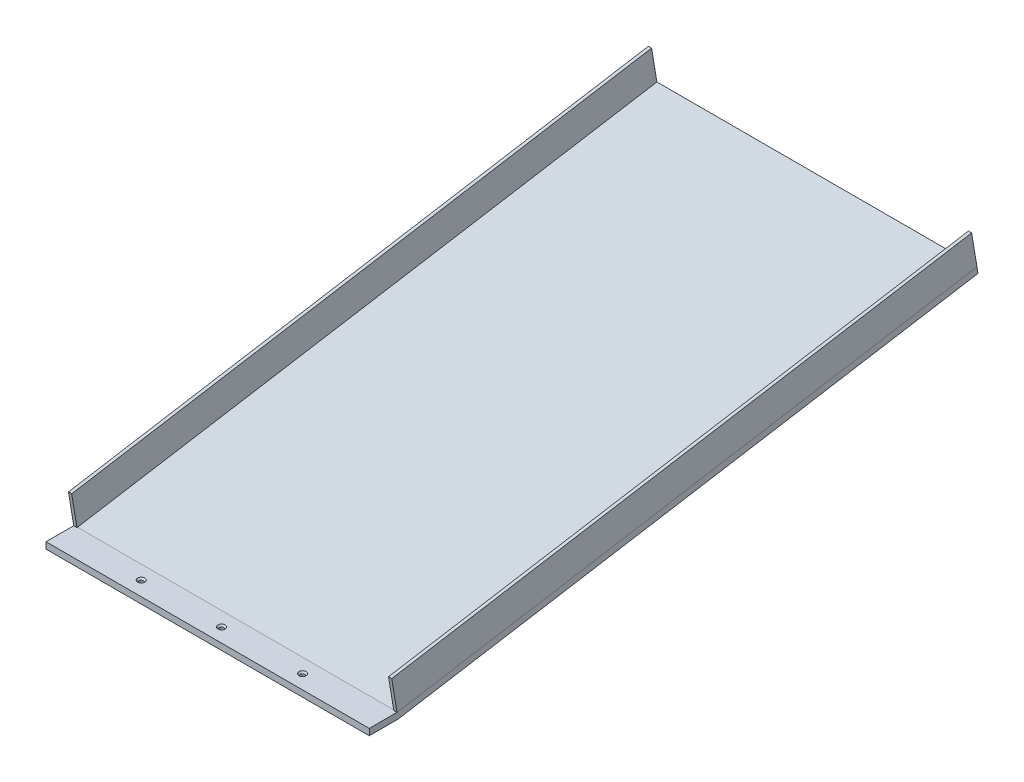
ISO-10303-21;
HEADER;
FILE_DESCRIPTION(('STEP AP214'),'2;1');
FILE_NAME('part.step','',(''),(''),'','','');
FILE_SCHEMA(('AUTOMOTIVE_DESIGN { 1 0 10303 214 1 1 1 1 }'));
ENDSEC;
DATA;
#1=APPLICATION_CONTEXT('core data for automotive mechanical design processes');
#2=APPLICATION_PROTOCOL_DEFINITION('international standard','automotive_design',2000,#1);
#3=PRODUCT_CONTEXT('',#1,'mechanical');
#4=PRODUCT('Part','Part','',(#3));
#5=PRODUCT_RELATED_PRODUCT_CATEGORY('part','',(#4));
#6=PRODUCT_DEFINITION_FORMATION('','',#4);
#7=PRODUCT_DEFINITION_CONTEXT('part definition',#1,'design');
#8=PRODUCT_DEFINITION('design','',#6,#7);
#9=PRODUCT_DEFINITION_SHAPE('','',#8);
#10=(LENGTH_UNIT() NAMED_UNIT(*) SI_UNIT(.MILLI.,.METRE.));
#11=(NAMED_UNIT(*) PLANE_ANGLE_UNIT() SI_UNIT($,.RADIAN.));
#12=(NAMED_UNIT(*) SI_UNIT($,.STERADIAN.) SOLID_ANGLE_UNIT());
#13=UNCERTAINTY_MEASURE_WITH_UNIT(LENGTH_MEASURE(1.E-05),#10,'distance_accuracy_value','');
#14=(GEOMETRIC_REPRESENTATION_CONTEXT(3) GLOBAL_UNCERTAINTY_ASSIGNED_CONTEXT((#13)) GLOBAL_UNIT_ASSIGNED_CONTEXT((#10,
#11,#12)) REPRESENTATION_CONTEXT('',''));
#15=CARTESIAN_POINT('',(0.,0.,0.));
#16=DIRECTION('',(0.,0.,1.));
#17=DIRECTION('',(1.,0.,0.));
#18=AXIS2_PLACEMENT_3D('',#15,#16,#17);
#19=CARTESIAN_POINT('',(125.73,30.4117752847834,5.03506213324225));
#20=DIRECTION('',(0.,-0.163339393700245,0.986569937949478));
#21=DIRECTION('',(0.,-0.986569937949478,-0.163339393700245));
#22=AXIS2_PLACEMENT_3D('',#19,#20,#21);
#23=PLANE('',#22);
#24=DIRECTION('',(0.,-0.986569937949478,-0.163339393700245));
#25=VECTOR('',#24,1.);
#26=CARTESIAN_POINT('',(128.27,30.4117752847834,5.03506213324225));
#27=LINE('',#26,#25);
#28=CARTESIAN_POINT('',(128.27,30.4117752847834,5.03506213324225));
#29=VERTEX_POINT('',#28);
#30=CARTESIAN_POINT('',(128.27,5.01177528478336,0.829764119997197));
#31=VERTEX_POINT('',#30);
#32=EDGE_CURVE('E112',#29,#31,#27,.T.);
#33=ORIENTED_EDGE('',*,*,#32,.F.);
#34=DIRECTION('',(1.,0.,0.));
#35=VECTOR('',#34,1.);
#36=CARTESIAN_POINT('',(125.73,30.4117752847834,5.03506213324225));
#37=LINE('',#36,#35);
#38=CARTESIAN_POINT('',(125.73,30.4117752847834,5.03506213324225));
#39=VERTEX_POINT('',#38);
#40=EDGE_CURVE('E12',#39,#29,#37,.T.);
#41=ORIENTED_EDGE('',*,*,#40,.F.);
#42=DIRECTION('',(0.,-0.986569937949478,-0.163339393700245));
#43=VECTOR('',#42,1.);
#44=CARTESIAN_POINT('',(125.73,30.4117752847834,5.03506213324225));
#45=LINE('',#44,#43);
#46=CARTESIAN_POINT('',(125.73,5.01177528478336,0.829764119997197));
#47=VERTEX_POINT('',#46);
#48=EDGE_CURVE('E106',#39,#47,#45,.T.);
#49=ORIENTED_EDGE('',*,*,#48,.T.);
#50=DIRECTION('',(1.,0.,0.));
#51=VECTOR('',#50,1.);
#52=CARTESIAN_POINT('',(125.73,5.01177528478336,0.829764119997197));
#53=LINE('',#52,#51);
#54=EDGE_CURVE('E51',#47,#31,#53,.T.);
#55=ORIENTED_EDGE('',*,*,#54,.T.);
#56=EDGE_LOOP('',(#33,#41,#49,#55));
#57=FACE_BOUND('',#56,.T.);
#58=ADVANCED_FACE('F48',(#57),#23,.T.);
#59=CARTESIAN_POINT('',(125.73,106.611775284784,-455.212937866758));
#60=DIRECTION('',(0.,0.986569937949478,0.163339393700245));
#61=DIRECTION('',(0.,-0.163339393700245,0.986569937949478));
#62=AXIS2_PLACEMENT_3D('',#59,#60,#61);
#63=PLANE('',#62);
#64=DIRECTION('',(0.,-0.163339393700245,0.986569937949478));
#65=VECTOR('',#64,1.);
#66=CARTESIAN_POINT('',(128.27,106.611775284784,-455.212937866758));
#67=LINE('',#66,#65);
#68=CARTESIAN_POINT('',(128.27,106.611775284784,-455.212937866758));
#69=VERTEX_POINT('',#68);
#70=EDGE_CURVE('E108',#69,#29,#67,.T.);
#71=ORIENTED_EDGE('',*,*,#70,.F.);
#72=DIRECTION('',(1.,0.,0.));
#73=VECTOR('',#72,1.);
#74=CARTESIAN_POINT('',(125.73,106.611775284784,-455.212937866758));
#75=LINE('',#74,#73);
#76=CARTESIAN_POINT('',(125.73,106.611775284784,-455.212937866758));
#77=VERTEX_POINT('',#76);
#78=EDGE_CURVE('E57',#77,#69,#75,.T.);
#79=ORIENTED_EDGE('',*,*,#78,.F.);
#80=DIRECTION('',(0.,-0.163339393700245,0.986569937949478));
#81=VECTOR('',#80,1.);
#82=CARTESIAN_POINT('',(125.73,106.611775284784,-455.212937866758));
#83=LINE('',#82,#81);
#84=EDGE_CURVE('E103',#77,#39,#83,.T.);
#85=ORIENTED_EDGE('',*,*,#84,.T.);
#86=ORIENTED_EDGE('',*,*,#40,.T.);
#87=EDGE_LOOP('',(#71,#79,#85,#86));
#88=FACE_BOUND('',#87,.T.);
#89=ADVANCED_FACE('F122',(#88),#63,.T.);
#90=CARTESIAN_POINT('',(125.73,81.2117752847833,-459.418235880003));
#91=DIRECTION('',(0.,0.163339393700246,-0.986569937949478));
#92=DIRECTION('',(0.,0.986569937949478,0.163339393700246));
#93=AXIS2_PLACEMENT_3D('',#90,#91,#92);
#94=PLANE('',#93);
#95=DIRECTION('',(0.,0.986569937949478,0.163339393700246));
#96=VECTOR('',#95,1.);
#97=CARTESIAN_POINT('',(128.27,81.2117752847833,-459.418235880003));
#98=LINE('',#97,#96);
#99=CARTESIAN_POINT('',(128.27,81.2117752847833,-459.418235880003));
#100=VERTEX_POINT('',#99);
#101=EDGE_CURVE('E98',#100,#69,#98,.T.);
#102=ORIENTED_EDGE('',*,*,#101,.F.);
#103=DIRECTION('',(1.,0.,0.));
#104=VECTOR('',#103,1.);
#105=CARTESIAN_POINT('',(125.73,81.2117752847833,-459.418235880003));
#106=LINE('',#105,#104);
#107=CARTESIAN_POINT('',(125.73,81.2117752847833,-459.418235880003));
#108=VERTEX_POINT('',#107);
#109=EDGE_CURVE('E93',#108,#100,#106,.T.);
#110=ORIENTED_EDGE('',*,*,#109,.F.);
#111=DIRECTION('',(0.,0.986569937949478,0.163339393700246));
#112=VECTOR('',#111,1.);
#113=CARTESIAN_POINT('',(125.73,81.2117752847833,-459.418235880003));
#114=LINE('',#113,#112);
#115=EDGE_CURVE('E96',#108,#77,#114,.T.);
#116=ORIENTED_EDGE('',*,*,#115,.T.);
#117=ORIENTED_EDGE('',*,*,#78,.T.);
#118=EDGE_LOOP('',(#102,#110,#116,#117));
#119=FACE_BOUND('',#118,.T.);
#120=ADVANCED_FACE('F95',(#119),#94,.T.);
#121=CARTESIAN_POINT('',(125.73,5.01177528478336,0.829764119997197));
#122=DIRECTION('',(0.,-0.986569937949478,-0.163339393700245));
#123=DIRECTION('',(0.,0.163339393700245,-0.986569937949478));
#124=AXIS2_PLACEMENT_3D('',#121,#122,#123);
#125=PLANE('',#124);
#126=DIRECTION('',(0.,0.163339393700245,-0.986569937949478));
#127=VECTOR('',#126,1.);
#128=CARTESIAN_POINT('',(128.27,5.01177528478336,0.829764119997197));
#129=LINE('',#128,#127);
#130=EDGE_CURVE('E115',#31,#100,#129,.T.);
#131=ORIENTED_EDGE('',*,*,#130,.F.);
#132=ORIENTED_EDGE('',*,*,#54,.F.);
#133=DIRECTION('',(0.,0.163339393700245,-0.986569937949478));
#134=VECTOR('',#133,1.);
#135=CARTESIAN_POINT('',(125.73,5.01177528478336,0.829764119997197));
#136=LINE('',#135,#134);
#137=EDGE_CURVE('E102',#47,#108,#136,.T.);
#138=ORIENTED_EDGE('',*,*,#137,.T.);
#139=ORIENTED_EDGE('',*,*,#109,.T.);
#140=EDGE_LOOP('',(#131,#132,#138,#139));
#141=FACE_BOUND('',#140,.T.);
#142=ADVANCED_FACE('F105',(#141),#125,.T.);
#143=CARTESIAN_POINT('',(125.73,0.,0.));
#144=DIRECTION('',(1.,0.,0.));
#145=DIRECTION('',(0.,0.,-1.));
#146=AXIS2_PLACEMENT_3D('',#143,#144,#145);
#147=PLANE('',#146);
#148=ORIENTED_EDGE('',*,*,#48,.F.);
#149=ORIENTED_EDGE('',*,*,#84,.F.);
#150=ORIENTED_EDGE('',*,*,#115,.F.);
#151=ORIENTED_EDGE('',*,*,#137,.F.);
#152=EDGE_LOOP('',(#148,#149,#150,#151));
#153=FACE_BOUND('',#152,.T.);
#154=ADVANCED_FACE('F101',(#153),#147,.F.);
#155=CARTESIAN_POINT('',(128.27,0.,0.));
#156=DIRECTION('',(1.,0.,0.));
#157=DIRECTION('',(0.,0.,-1.));
#158=AXIS2_PLACEMENT_3D('',#155,#156,#157);
#159=PLANE('',#158);
#160=ORIENTED_EDGE('',*,*,#32,.T.);
#161=ORIENTED_EDGE('',*,*,#130,.T.);
#162=ORIENTED_EDGE('',*,*,#101,.T.);
#163=ORIENTED_EDGE('',*,*,#70,.T.);
#164=EDGE_LOOP('',(#160,#161,#162,#163));
#165=FACE_BOUND('',#164,.T.);
#166=ADVANCED_FACE('F121',(#165),#159,.T.);
#167=CLOSED_SHELL('',(#58,#89,#120,#142,#154,#166));
#168=MANIFOLD_SOLID_BREP('B2',#167);
#169=CARTESIAN_POINT('',(128.27,81.2117752847833,-459.418235880003));
#170=DIRECTION('',(0.,-0.163339393700245,0.986569937949478));
#171=DIRECTION('',(0.,-0.986569937949478,-0.163339393700245));
#172=AXIS2_PLACEMENT_3D('',#169,#170,#171);
#173=PLANE('',#172);
#174=DIRECTION('',(-1.,0.,0.));
#175=VECTOR('',#174,1.);
#176=CARTESIAN_POINT('',(128.27,76.2,-460.248));
#177=LINE('',#176,#175);
#178=CARTESIAN_POINT('',(128.27,76.2,-460.248));
#179=VERTEX_POINT('',#178);
#180=CARTESIAN_POINT('',(-128.27,76.2,-460.248));
#181=VERTEX_POINT('',#180);
#182=EDGE_CURVE('E302',#179,#181,#177,.T.);
#183=ORIENTED_EDGE('',*,*,#182,.T.);
#184=DIRECTION('',(0.,-0.986569937949478,-0.163339393700245));
#185=VECTOR('',#184,1.);
#186=CARTESIAN_POINT('',(-128.27,81.2117752847833,-459.418235880003));
#187=LINE('',#186,#185);
#188=CARTESIAN_POINT('',(-128.27,106.611775284784,-455.212937866758));
#189=VERTEX_POINT('',#188);
#190=EDGE_CURVE('E179',#189,#181,#187,.T.);
#191=ORIENTED_EDGE('',*,*,#190,.F.);
#192=DIRECTION('',(-1.,0.,0.));
#193=VECTOR('',#192,1.);
#194=CARTESIAN_POINT('',(-125.73,106.611775284784,-455.212937866758));
#195=LINE('',#194,#193);
#196=CARTESIAN_POINT('',(-125.73,106.611775284784,-455.212937866758));
#197=VERTEX_POINT('',#196);
#198=EDGE_CURVE('E298',#197,#189,#195,.T.);
#199=ORIENTED_EDGE('',*,*,#198,.F.);
#200=DIRECTION('',(0.,-0.986569937949478,-0.163339393700246));
#201=VECTOR('',#200,1.);
#202=CARTESIAN_POINT('',(-125.73,81.2117752847833,-459.418235880003));
#203=LINE('',#202,#201);
#204=CARTESIAN_POINT('',(-125.73,81.2117752847833,-459.418235880003));
#205=VERTEX_POINT('',#204);
#206=EDGE_CURVE('E290',#197,#205,#203,.T.);
#207=ORIENTED_EDGE('',*,*,#206,.T.);
#208=DIRECTION('',(-1.,0.,0.));
#209=VECTOR('',#208,1.);
#210=CARTESIAN_POINT('',(128.27,81.2117752847833,-459.418235880003));
#211=LINE('',#210,#209);
#212=CARTESIAN_POINT('',(128.27,81.2117752847833,-459.418235880003));
#213=VERTEX_POINT('',#212);
#214=EDGE_CURVE('E305',#213,#205,#211,.T.);
#215=ORIENTED_EDGE('',*,*,#214,.F.);
#216=DIRECTION('',(0.,-0.986569937949478,-0.163339393700245));
#217=VECTOR('',#216,1.);
#218=CARTESIAN_POINT('',(128.27,81.2117752847833,-459.418235880003));
#219=LINE('',#218,#217);
#220=EDGE_CURVE('E312',#213,#179,#219,.T.);
#221=ORIENTED_EDGE('',*,*,#220,.T.);
#222=EDGE_LOOP('',(#183,#191,#199,#207,#215,#221));
#223=FACE_BOUND('',#222,.T.);
#224=ADVANCED_FACE('F171',(#223),#173,.F.);
#225=CARTESIAN_POINT('',(-128.27,81.2117752847833,-459.418235880003));
#226=DIRECTION('',(1.,0.,0.));
#227=DIRECTION('',(0.,0.,-1.));
#228=AXIS2_PLACEMENT_3D('',#225,#226,#227);
#229=PLANE('',#228);
#230=DIRECTION('',(0.,-0.163339393700245,0.986569937949478));
#231=VECTOR('',#230,1.);
#232=CARTESIAN_POINT('',(-128.27,76.2,-460.248));
#233=LINE('',#232,#231);
#234=CARTESIAN_POINT('',(-128.27,0.,0.));
#235=VERTEX_POINT('',#234);
#236=EDGE_CURVE('E316',#181,#235,#233,.T.);
#237=ORIENTED_EDGE('',*,*,#236,.T.);
#238=DIRECTION('',(0.,0.,1.));
#239=VECTOR('',#238,1.);
#240=CARTESIAN_POINT('',(-128.27,0.,0.));
#241=LINE('',#240,#239);
#242=CARTESIAN_POINT('',(-128.27,0.,22.86));
#243=VERTEX_POINT('',#242);
#244=EDGE_CURVE('E268',#235,#243,#241,.T.);
#245=ORIENTED_EDGE('',*,*,#244,.T.);
#246=DIRECTION('',(0.,-1.,0.));
#247=VECTOR('',#246,1.);
#248=CARTESIAN_POINT('',(-128.27,5.08,22.86));
#249=LINE('',#248,#247);
#250=CARTESIAN_POINT('',(-128.27,5.08,22.86));
#251=VERTEX_POINT('',#250);
#252=EDGE_CURVE('E258',#251,#243,#249,.T.);
#253=ORIENTED_EDGE('',*,*,#252,.F.);
#254=DIRECTION('',(0.,0.,1.));
#255=VECTOR('',#254,1.);
#256=CARTESIAN_POINT('',(-128.27,5.08,0.));
#257=LINE('',#256,#255);
#258=CARTESIAN_POINT('',(-128.27,5.08,0.841059602649006));
#259=VERTEX_POINT('',#258);
#260=EDGE_CURVE('E243',#259,#251,#257,.T.);
#261=ORIENTED_EDGE('',*,*,#260,.F.);
#262=DIRECTION('',(0.,-0.986569937949478,-0.163339393700245));
#263=VECTOR('',#262,1.);
#264=CARTESIAN_POINT('',(-128.27,5.01177528478335,0.829764119997243));
#265=LINE('',#264,#263);
#266=CARTESIAN_POINT('',(-128.27,30.4117752847834,5.03506213324225));
#267=VERTEX_POINT('',#266);
#268=EDGE_CURVE('E186',#267,#259,#265,.T.);
#269=ORIENTED_EDGE('',*,*,#268,.F.);
#270=DIRECTION('',(0.,0.163339393700245,-0.986569937949478));
#271=VECTOR('',#270,1.);
#272=CARTESIAN_POINT('',(-128.27,106.611775284784,-455.212937866758));
#273=LINE('',#272,#271);
#274=EDGE_CURVE('E279',#267,#189,#273,.T.);
#275=ORIENTED_EDGE('',*,*,#274,.T.);
#276=ORIENTED_EDGE('',*,*,#190,.T.);
#277=EDGE_LOOP('',(#237,#245,#253,#261,#269,#275,#276));
#278=FACE_BOUND('',#277,.T.);
#279=ADVANCED_FACE('F266',(#278),#229,.F.);
#280=CARTESIAN_POINT('',(-128.27,5.01177528478335,0.829764119997243));
#281=DIRECTION('',(0.,0.163339393700245,-0.986569937949478));
#282=DIRECTION('',(0.,0.986569937949478,0.163339393700245));
#283=AXIS2_PLACEMENT_3D('',#280,#281,#282);
#284=PLANE('',#283);
#285=ORIENTED_EDGE('',*,*,#268,.T.);
#286=DIRECTION('',(1.,0.,0.));
#287=VECTOR('',#286,1.);
#288=CARTESIAN_POINT('',(-128.27,5.08,0.841059602649006));
#289=LINE('',#288,#287);
#290=CARTESIAN_POINT('',(-125.73,5.08,0.841059602648959));
#291=VERTEX_POINT('',#290);
#292=EDGE_CURVE('E249',#259,#291,#289,.T.);
#293=ORIENTED_EDGE('',*,*,#292,.T.);
#294=DIRECTION('',(0.,0.986569937949478,0.163339393700245));
#295=VECTOR('',#294,1.);
#296=CARTESIAN_POINT('',(-125.73,30.4117752847834,5.03506213324225));
#297=LINE('',#296,#295);
#298=CARTESIAN_POINT('',(-125.73,30.4117752847834,5.03506213324225));
#299=VERTEX_POINT('',#298);
#300=EDGE_CURVE('E283',#291,#299,#297,.T.);
#301=ORIENTED_EDGE('',*,*,#300,.T.);
#302=DIRECTION('',(-1.,0.,0.));
#303=VECTOR('',#302,1.);
#304=CARTESIAN_POINT('',(-125.73,30.4117752847834,5.03506213324225));
#305=LINE('',#304,#303);
#306=EDGE_CURVE('E294',#299,#267,#305,.T.);
#307=ORIENTED_EDGE('',*,*,#306,.T.);
#308=EDGE_LOOP('',(#285,#293,#301,#307));
#309=FACE_BOUND('',#308,.T.);
#310=ADVANCED_FACE('F367',(#309),#284,.F.);
#311=CARTESIAN_POINT('',(128.27,5.01177528478336,0.829764119997197));
#312=DIRECTION('',(-1.,0.,0.));
#313=DIRECTION('',(0.,0.,1.));
#314=AXIS2_PLACEMENT_3D('',#311,#312,#313);
#315=PLANE('',#314);
#316=DIRECTION('',(0.,0.,-1.));
#317=VECTOR('',#316,1.);
#318=CARTESIAN_POINT('',(128.27,0.,0.));
#319=LINE('',#318,#317);
#320=CARTESIAN_POINT('',(128.27,0.,22.86));
#321=VERTEX_POINT('',#320);
#322=CARTESIAN_POINT('',(128.27,0.,0.));
#323=VERTEX_POINT('',#322);
#324=EDGE_CURVE('E253',#321,#323,#319,.T.);
#325=ORIENTED_EDGE('',*,*,#324,.T.);
#326=DIRECTION('',(0.,0.163339393700245,-0.986569937949478));
#327=VECTOR('',#326,1.);
#328=CARTESIAN_POINT('',(128.27,0.,0.));
#329=LINE('',#328,#327);
#330=EDGE_CURVE('E309',#323,#179,#329,.T.);
#331=ORIENTED_EDGE('',*,*,#330,.T.);
#332=ORIENTED_EDGE('',*,*,#220,.F.);
#333=DIRECTION('',(0.,0.163339393700245,-0.986569937949478));
#334=VECTOR('',#333,1.);
#335=CARTESIAN_POINT('',(128.27,5.01177528478336,0.829764119997197));
#336=LINE('',#335,#334);
#337=CARTESIAN_POINT('',(128.27,5.08,0.417686840088665));
#338=VERTEX_POINT('',#337);
#339=EDGE_CURVE('E308',#338,#213,#336,.T.);
#340=ORIENTED_EDGE('',*,*,#339,.F.);
#341=DIRECTION('',(0.,0.,-1.));
#342=VECTOR('',#341,1.);
#343=CARTESIAN_POINT('',(128.27,5.08,0.));
#344=LINE('',#343,#342);
#345=CARTESIAN_POINT('',(128.27,5.08,22.86));
#346=VERTEX_POINT('',#345);
#347=EDGE_CURVE('E264',#346,#338,#344,.T.);
#348=ORIENTED_EDGE('',*,*,#347,.F.);
#349=DIRECTION('',(0.,-1.,0.));
#350=VECTOR('',#349,1.);
#351=CARTESIAN_POINT('',(128.27,5.08,22.86));
#352=LINE('',#351,#350);
#353=EDGE_CURVE('E261',#346,#321,#352,.T.);
#354=ORIENTED_EDGE('',*,*,#353,.T.);
#355=EDGE_LOOP('',(#325,#331,#332,#340,#348,#354));
#356=FACE_BOUND('',#355,.T.);
#357=ADVANCED_FACE('F356',(#356),#315,.F.);
#358=CARTESIAN_POINT('',(0.,5.01177528478335,0.829764119997243));
#359=DIRECTION('',(0.,0.986569937949478,0.163339393700245));
#360=DIRECTION('',(0.,-0.163339393700245,0.986569937949478));
#361=AXIS2_PLACEMENT_3D('',#358,#359,#360);
#362=PLANE('',#361);
#363=DIRECTION('',(-1.,0.,0.));
#364=VECTOR('',#363,1.);
#365=CARTESIAN_POINT('',(0.,5.08,0.417686840088665));
#366=LINE('',#365,#364);
#367=CARTESIAN_POINT('',(-125.73,5.08,0.417686840088666));
#368=VERTEX_POINT('',#367);
#369=EDGE_CURVE('E194',#338,#368,#366,.T.);
#370=ORIENTED_EDGE('',*,*,#369,.F.);
#371=ORIENTED_EDGE('',*,*,#339,.T.);
#372=ORIENTED_EDGE('',*,*,#214,.T.);
#373=DIRECTION('',(0.,-0.163339393700245,0.986569937949478));
#374=VECTOR('',#373,1.);
#375=CARTESIAN_POINT('',(-125.73,5.01177528478336,0.829764119997197));
#376=LINE('',#375,#374);
#377=EDGE_CURVE('E280',#205,#368,#376,.T.);
#378=ORIENTED_EDGE('',*,*,#377,.T.);
#379=EDGE_LOOP('',(#370,#371,#372,#378));
#380=FACE_BOUND('',#379,.T.);
#381=ADVANCED_FACE('F363',(#380),#362,.T.);
#382=CARTESIAN_POINT('',(0.,0.,0.));
#383=DIRECTION('',(0.,0.986569937949478,0.163339393700245));
#384=DIRECTION('',(0.,-0.163339393700245,0.986569937949478));
#385=AXIS2_PLACEMENT_3D('',#382,#383,#384);
#386=PLANE('',#385);
#387=ORIENTED_EDGE('',*,*,#182,.F.);
#388=ORIENTED_EDGE('',*,*,#330,.F.);
#389=DIRECTION('',(1.,0.,0.));
#390=VECTOR('',#389,1.);
#391=CARTESIAN_POINT('',(-128.27,0.,0.));
#392=LINE('',#391,#390);
#393=EDGE_CURVE('E319',#235,#323,#392,.T.);
#394=ORIENTED_EDGE('',*,*,#393,.F.);
#395=ORIENTED_EDGE('',*,*,#236,.F.);
#396=EDGE_LOOP('',(#387,#388,#394,#395));
#397=FACE_BOUND('',#396,.T.);
#398=ADVANCED_FACE('F338',(#397),#386,.F.);
#399=CARTESIAN_POINT('',(-125.73,106.611775284784,-455.212937866758));
#400=DIRECTION('',(0.,0.986569937949478,0.163339393700245));
#401=DIRECTION('',(0.,-0.163339393700245,0.986569937949478));
#402=AXIS2_PLACEMENT_3D('',#399,#400,#401);
#403=PLANE('',#402);
#404=ORIENTED_EDGE('',*,*,#274,.F.);
#405=ORIENTED_EDGE('',*,*,#306,.F.);
#406=DIRECTION('',(0.,0.163339393700245,-0.986569937949478));
#407=VECTOR('',#406,1.);
#408=CARTESIAN_POINT('',(-125.73,106.611775284784,-455.212937866758));
#409=LINE('',#408,#407);
#410=EDGE_CURVE('E286',#299,#197,#409,.T.);
#411=ORIENTED_EDGE('',*,*,#410,.T.);
#412=ORIENTED_EDGE('',*,*,#198,.T.);
#413=EDGE_LOOP('',(#404,#405,#411,#412));
#414=FACE_BOUND('',#413,.T.);
#415=ADVANCED_FACE('F366',(#414),#403,.T.);
#416=CARTESIAN_POINT('',(-125.73,0.,0.));
#417=DIRECTION('',(1.,0.,0.));
#418=DIRECTION('',(0.,0.,-1.));
#419=AXIS2_PLACEMENT_3D('',#416,#417,#418);
#420=PLANE('',#419);
#421=DIRECTION('',(0.,0.,1.));
#422=VECTOR('',#421,1.);
#423=CARTESIAN_POINT('',(-125.73,5.08,0.));
#424=LINE('',#423,#422);
#425=EDGE_CURVE('E46',#368,#291,#424,.T.);
#426=ORIENTED_EDGE('',*,*,#425,.F.);
#427=ORIENTED_EDGE('',*,*,#377,.F.);
#428=ORIENTED_EDGE('',*,*,#206,.F.);
#429=ORIENTED_EDGE('',*,*,#410,.F.);
#430=ORIENTED_EDGE('',*,*,#300,.F.);
#431=EDGE_LOOP('',(#426,#427,#428,#429,#430));
#432=FACE_BOUND('',#431,.T.);
#433=ADVANCED_FACE('F360',(#432),#420,.T.);
#434=CARTESIAN_POINT('',(0.,5.08,0.));
#435=DIRECTION('',(0.,1.,0.));
#436=DIRECTION('',(0.,0.,1.));
#437=AXIS2_PLACEMENT_3D('',#434,#435,#436);
#438=PLANE('',#437);
#439=CARTESIAN_POINT('',(-64.135,5.08,11.43));
#440=DIRECTION('',(0.,1.,0.));
#441=DIRECTION('',(0.,0.,1.));
#442=AXIS2_PLACEMENT_3D('',#439,#440,#441);
#443=CIRCLE('',#442,2.8575);
#444=CARTESIAN_POINT('',(-64.135,5.08,14.2875));
#445=VERTEX_POINT('',#444);
#446=EDGE_CURVE('E521',#445,#445,#443,.T.);
#447=ORIENTED_EDGE('',*,*,#446,.F.);
#448=EDGE_LOOP('',(#447));
#449=FACE_BOUND('',#448,.T.);
#450=CARTESIAN_POINT('',(0.,5.08,11.7446866106844));
#451=DIRECTION('',(0.,1.,0.));
#452=DIRECTION('',(0.,0.,1.));
#453=AXIS2_PLACEMENT_3D('',#450,#451,#452);
#454=CIRCLE('',#453,2.8575);
#455=CARTESIAN_POINT('',(0.,5.08,14.6021866106844));
#456=VERTEX_POINT('',#455);
#457=EDGE_CURVE('E531',#456,#456,#454,.T.);
#458=ORIENTED_EDGE('',*,*,#457,.F.);
#459=EDGE_LOOP('',(#458));
#460=FACE_BOUND('',#459,.T.);
#461=CARTESIAN_POINT('',(64.2267858540762,5.08,11.6916892774081));
#462=DIRECTION('',(0.,1.,0.));
#463=DIRECTION('',(0.,0.,1.));
#464=AXIS2_PLACEMENT_3D('',#461,#462,#463);
#465=CIRCLE('',#464,2.8575);
#466=CARTESIAN_POINT('',(64.2267858540762,5.08,14.5491892774081));
#467=VERTEX_POINT('',#466);
#468=EDGE_CURVE('E543',#467,#467,#465,.T.);
#469=ORIENTED_EDGE('',*,*,#468,.F.);
#470=EDGE_LOOP('',(#469));
#471=FACE_BOUND('',#470,.T.);
#472=ORIENTED_EDGE('',*,*,#292,.F.);
#473=ORIENTED_EDGE('',*,*,#260,.T.);
#474=DIRECTION('',(1.,0.,0.));
#475=VECTOR('',#474,1.);
#476=CARTESIAN_POINT('',(-128.27,5.08,22.86));
#477=LINE('',#476,#475);
#478=EDGE_CURVE('E247',#251,#346,#477,.T.);
#479=ORIENTED_EDGE('',*,*,#478,.T.);
#480=ORIENTED_EDGE('',*,*,#347,.T.);
#481=ORIENTED_EDGE('',*,*,#369,.T.);
#482=ORIENTED_EDGE('',*,*,#425,.T.);
#483=EDGE_LOOP('',(#472,#473,#479,#480,#481,#482));
#484=FACE_BOUND('',#483,.T.);
#485=ADVANCED_FACE('F245',(#449,#460,#471,#484),#438,.T.);
#486=CARTESIAN_POINT('',(-128.27,5.08,22.86));
#487=DIRECTION('',(0.,0.,-1.));
#488=DIRECTION('',(-1.,0.,0.));
#489=AXIS2_PLACEMENT_3D('',#486,#487,#488);
#490=PLANE('',#489);
#491=DIRECTION('',(1.,0.,0.));
#492=VECTOR('',#491,1.);
#493=CARTESIAN_POINT('',(-128.27,0.,22.86));
#494=LINE('',#493,#492);
#495=EDGE_CURVE('E343',#243,#321,#494,.T.);
#496=ORIENTED_EDGE('',*,*,#495,.T.);
#497=ORIENTED_EDGE('',*,*,#353,.F.);
#498=ORIENTED_EDGE('',*,*,#478,.F.);
#499=ORIENTED_EDGE('',*,*,#252,.T.);
#500=EDGE_LOOP('',(#496,#497,#498,#499));
#501=FACE_BOUND('',#500,.T.);
#502=ADVANCED_FACE('F257',(#501),#490,.F.);
#503=CARTESIAN_POINT('',(0.,0.,0.));
#504=DIRECTION('',(0.,1.,0.));
#505=DIRECTION('',(0.,0.,1.));
#506=AXIS2_PLACEMENT_3D('',#503,#504,#505);
#507=PLANE('',#506);
#508=CARTESIAN_POINT('',(-64.135,0.,11.43));
#509=DIRECTION('',(0.,1.,0.));
#510=DIRECTION('',(0.,0.,1.));
#511=AXIS2_PLACEMENT_3D('',#508,#509,#510);
#512=CIRCLE('',#511,1.7272);
#513=CARTESIAN_POINT('',(-64.135,0.,13.1572));
#514=VERTEX_POINT('',#513);
#515=EDGE_CURVE('E525',#514,#514,#512,.T.);
#516=ORIENTED_EDGE('',*,*,#515,.T.);
#517=EDGE_LOOP('',(#516));
#518=FACE_BOUND('',#517,.T.);
#519=CARTESIAN_POINT('',(0.,0.,11.7446866106844));
#520=DIRECTION('',(0.,1.,0.));
#521=DIRECTION('',(0.,0.,1.));
#522=AXIS2_PLACEMENT_3D('',#519,#520,#521);
#523=CIRCLE('',#522,1.7272);
#524=CARTESIAN_POINT('',(0.,0.,13.4718866106844));
#525=VERTEX_POINT('',#524);
#526=EDGE_CURVE('E539',#525,#525,#523,.T.);
#527=ORIENTED_EDGE('',*,*,#526,.T.);
#528=EDGE_LOOP('',(#527));
#529=FACE_BOUND('',#528,.T.);
#530=CARTESIAN_POINT('',(64.2267858540762,0.,11.6916892774081));
#531=DIRECTION('',(0.,1.,0.));
#532=DIRECTION('',(0.,0.,1.));
#533=AXIS2_PLACEMENT_3D('',#530,#531,#532);
#534=CIRCLE('',#533,1.7272);
#535=CARTESIAN_POINT('',(64.2267858540762,0.,13.4188892774081));
#536=VERTEX_POINT('',#535);
#537=EDGE_CURVE('E345',#536,#536,#534,.T.);
#538=ORIENTED_EDGE('',*,*,#537,.T.);
#539=EDGE_LOOP('',(#538));
#540=FACE_BOUND('',#539,.T.);
#541=ORIENTED_EDGE('',*,*,#244,.F.);
#542=ORIENTED_EDGE('',*,*,#393,.T.);
#543=ORIENTED_EDGE('',*,*,#324,.F.);
#544=ORIENTED_EDGE('',*,*,#495,.F.);
#545=EDGE_LOOP('',(#541,#542,#543,#544));
#546=FACE_BOUND('',#545,.T.);
#547=ADVANCED_FACE('F342',(#518,#529,#540,#546),#507,.F.);
#548=CARTESIAN_POINT('',(64.2267858540762,5.08,11.6916892774081));
#549=DIRECTION('',(0.,1.,0.));
#550=DIRECTION('',(0.,0.,1.));
#551=AXIS2_PLACEMENT_3D('',#548,#549,#550);
#552=CYLINDRICAL_SURFACE('',#551,1.7272);
#553=ORIENTED_EDGE('',*,*,#537,.F.);
#554=EDGE_LOOP('',(#553));
#555=FACE_BOUND('',#554,.T.);
#556=CARTESIAN_POINT('',(64.2267858540762,3.77973858931809,11.6916892774081));
#557=DIRECTION('',(0.,1.,0.));
#558=DIRECTION('',(0.,0.,1.));
#559=AXIS2_PLACEMENT_3D('',#556,#557,#558);
#560=CIRCLE('',#559,1.7272);
#561=CARTESIAN_POINT('',(64.2267858540762,3.77973858931809,13.4188892774081));
#562=VERTEX_POINT('',#561);
#563=EDGE_CURVE('E351',#562,#562,#560,.T.);
#564=ORIENTED_EDGE('',*,*,#563,.T.);
#565=EDGE_LOOP('',(#564));
#566=FACE_BOUND('',#565,.T.);
#567=ADVANCED_FACE('F449',(#555,#566),#552,.F.);
#568=CARTESIAN_POINT('',(64.2267858540762,5.08,11.6916892774081));
#569=DIRECTION('',(0.,1.,0.));
#570=DIRECTION('',(0.,0.,1.));
#571=AXIS2_PLACEMENT_3D('',#568,#569,#570);
#572=CONICAL_SURFACE('',#571,2.8575,0.715584993317675);
#573=ORIENTED_EDGE('',*,*,#563,.F.);
#574=EDGE_LOOP('',(#573));
#575=FACE_BOUND('',#574,.T.);
#576=ORIENTED_EDGE('',*,*,#468,.T.);
#577=EDGE_LOOP('',(#576));
#578=FACE_BOUND('',#577,.T.);
#579=ADVANCED_FACE('F459',(#575,#578),#572,.F.);
#580=CARTESIAN_POINT('',(0.,5.08,11.7446866106844));
#581=DIRECTION('',(0.,1.,0.));
#582=DIRECTION('',(0.,0.,1.));
#583=AXIS2_PLACEMENT_3D('',#580,#581,#582);
#584=CYLINDRICAL_SURFACE('',#583,1.7272);
#585=ORIENTED_EDGE('',*,*,#526,.F.);
#586=EDGE_LOOP('',(#585));
#587=FACE_BOUND('',#586,.T.);
#588=CARTESIAN_POINT('',(0.,3.77973858931809,11.7446866106844));
#589=DIRECTION('',(0.,1.,0.));
#590=DIRECTION('',(0.,0.,1.));
#591=AXIS2_PLACEMENT_3D('',#588,#589,#590);
#592=CIRCLE('',#591,1.7272);
#593=CARTESIAN_POINT('',(0.,3.77973858931809,13.4718866106844));
#594=VERTEX_POINT('',#593);
#595=EDGE_CURVE('E535',#594,#594,#592,.T.);
#596=ORIENTED_EDGE('',*,*,#595,.T.);
#597=EDGE_LOOP('',(#596));
#598=FACE_BOUND('',#597,.T.);
#599=ADVANCED_FACE('F469',(#587,#598),#584,.F.);
#600=CARTESIAN_POINT('',(0.,5.08,11.7446866106844));
#601=DIRECTION('',(0.,1.,0.));
#602=DIRECTION('',(0.,0.,1.));
#603=AXIS2_PLACEMENT_3D('',#600,#601,#602);
#604=CONICAL_SURFACE('',#603,2.8575,0.715584993317675);
#605=ORIENTED_EDGE('',*,*,#595,.F.);
#606=EDGE_LOOP('',(#605));
#607=FACE_BOUND('',#606,.T.);
#608=ORIENTED_EDGE('',*,*,#457,.T.);
#609=EDGE_LOOP('',(#608));
#610=FACE_BOUND('',#609,.T.);
#611=ADVANCED_FACE('F479',(#607,#610),#604,.F.);
#612=CARTESIAN_POINT('',(-64.135,5.08,11.43));
#613=DIRECTION('',(0.,1.,0.));
#614=DIRECTION('',(0.,0.,1.));
#615=AXIS2_PLACEMENT_3D('',#612,#613,#614);
#616=CYLINDRICAL_SURFACE('',#615,1.7272);
#617=ORIENTED_EDGE('',*,*,#515,.F.);
#618=EDGE_LOOP('',(#617));
#619=FACE_BOUND('',#618,.T.);
#620=CARTESIAN_POINT('',(-64.135,3.77973858931809,11.43));
#621=DIRECTION('',(0.,1.,0.));
#622=DIRECTION('',(0.,0.,1.));
#623=AXIS2_PLACEMENT_3D('',#620,#621,#622);
#624=CIRCLE('',#623,1.7272);
#625=CARTESIAN_POINT('',(-64.135,3.77973858931809,13.1572));
#626=VERTEX_POINT('',#625);
#627=EDGE_CURVE('E518',#626,#626,#624,.T.);
#628=ORIENTED_EDGE('',*,*,#627,.T.);
#629=EDGE_LOOP('',(#628));
#630=FACE_BOUND('',#629,.T.);
#631=ADVANCED_FACE('F489',(#619,#630),#616,.F.);
#632=CARTESIAN_POINT('',(-64.135,5.08,11.43));
#633=DIRECTION('',(0.,1.,0.));
#634=DIRECTION('',(0.,0.,1.));
#635=AXIS2_PLACEMENT_3D('',#632,#633,#634);
#636=CONICAL_SURFACE('',#635,2.8575,0.715584993317675);
#637=ORIENTED_EDGE('',*,*,#627,.F.);
#638=EDGE_LOOP('',(#637));
#639=FACE_BOUND('',#638,.T.);
#640=ORIENTED_EDGE('',*,*,#446,.T.);
#641=EDGE_LOOP('',(#640));
#642=FACE_BOUND('',#641,.T.);
#643=ADVANCED_FACE('F499',(#639,#642),#636,.F.);
#644=CLOSED_SHELL('',(#224,#279,#310,#357,#381,#398,#415,#433,#485,#502,#547,#567,#579,#599,
#611,#631,#643));
#645=MANIFOLD_SOLID_BREP('B6',#644);
#646=ADVANCED_BREP_SHAPE_REPRESENTATION('',(#18,#168,#645),#14);
#647=SHAPE_DEFINITION_REPRESENTATION(#9,#646);
ENDSEC;
END-ISO-10303-21;
